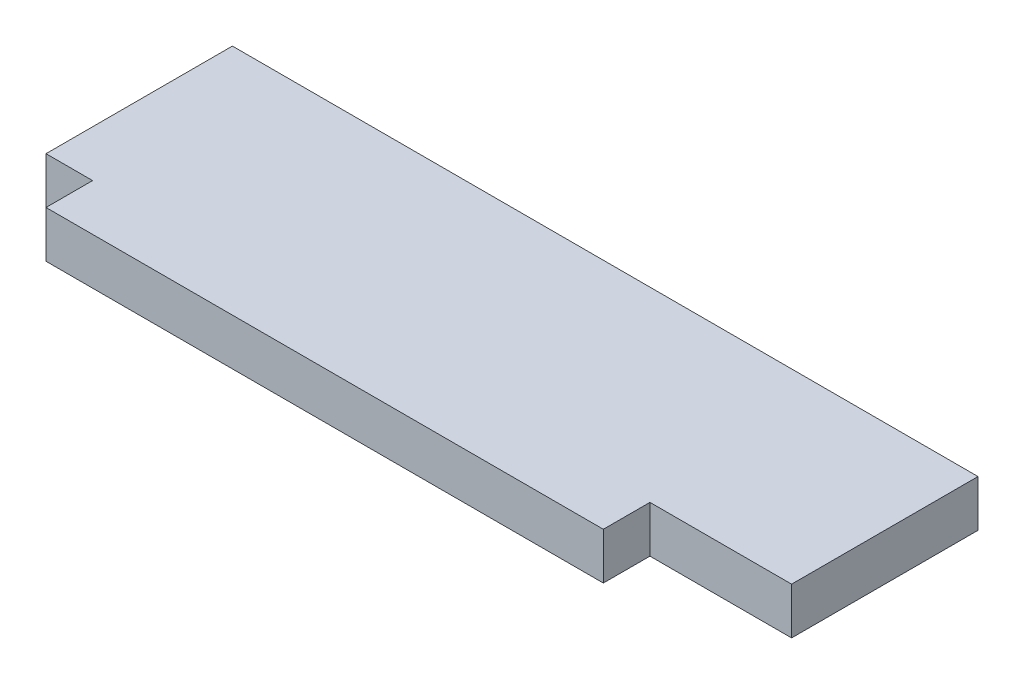
ISO-10303-21;
HEADER;
FILE_DESCRIPTION(('STEP AP214'),'2;1');
FILE_NAME('part.step','',(''),(''),'','','');
FILE_SCHEMA(('AUTOMOTIVE_DESIGN { 1 0 10303 214 1 1 1 1 }'));
ENDSEC;
DATA;
#1=APPLICATION_CONTEXT('core data for automotive mechanical design processes');
#2=APPLICATION_PROTOCOL_DEFINITION('international standard','automotive_design',2000,#1);
#3=PRODUCT_CONTEXT('',#1,'mechanical');
#4=PRODUCT('Part','Part','',(#3));
#5=PRODUCT_RELATED_PRODUCT_CATEGORY('part','',(#4));
#6=PRODUCT_DEFINITION_FORMATION('','',#4);
#7=PRODUCT_DEFINITION_CONTEXT('part definition',#1,'design');
#8=PRODUCT_DEFINITION('design','',#6,#7);
#9=PRODUCT_DEFINITION_SHAPE('','',#8);
#10=(LENGTH_UNIT() NAMED_UNIT(*) SI_UNIT(.MILLI.,.METRE.));
#11=(NAMED_UNIT(*) PLANE_ANGLE_UNIT() SI_UNIT($,.RADIAN.));
#12=(NAMED_UNIT(*) SI_UNIT($,.STERADIAN.) SOLID_ANGLE_UNIT());
#13=UNCERTAINTY_MEASURE_WITH_UNIT(LENGTH_MEASURE(1.E-05),#10,'distance_accuracy_value','');
#14=(GEOMETRIC_REPRESENTATION_CONTEXT(3) GLOBAL_UNCERTAINTY_ASSIGNED_CONTEXT((#13)) GLOBAL_UNIT_ASSIGNED_CONTEXT((#10,
#11,#12)) REPRESENTATION_CONTEXT('',''));
#15=CARTESIAN_POINT('',(0.,0.,0.));
#16=DIRECTION('',(0.,0.,1.));
#17=DIRECTION('',(1.,0.,0.));
#18=AXIS2_PLACEMENT_3D('',#15,#16,#17);
#19=CARTESIAN_POINT('',(0.,5.,0.));
#20=DIRECTION('',(0.,0.,-1.));
#21=DIRECTION('',(-1.,0.,0.));
#22=AXIS2_PLACEMENT_3D('',#19,#20,#21);
#23=PLANE('',#22);
#24=DIRECTION('',(1.,0.,0.));
#25=VECTOR('',#24,1.);
#26=CARTESIAN_POINT('',(0.,0.,0.));
#27=LINE('',#26,#25);
#28=CARTESIAN_POINT('',(0.,0.,0.));
#29=VERTEX_POINT('',#28);
#30=CARTESIAN_POINT('',(5.,0.,0.));
#31=VERTEX_POINT('',#30);
#32=EDGE_CURVE('E137',#29,#31,#27,.T.);
#33=ORIENTED_EDGE('',*,*,#32,.T.);
#34=DIRECTION('',(0.,-1.,0.));
#35=VECTOR('',#34,1.);
#36=CARTESIAN_POINT('',(5.,5.,0.));
#37=LINE('',#36,#35);
#38=CARTESIAN_POINT('',(5.,5.,0.));
#39=VERTEX_POINT('',#38);
#40=EDGE_CURVE('E11',#39,#31,#37,.T.);
#41=ORIENTED_EDGE('',*,*,#40,.F.);
#42=DIRECTION('',(1.,0.,0.));
#43=VECTOR('',#42,1.);
#44=CARTESIAN_POINT('',(0.,5.,0.));
#45=LINE('',#44,#43);
#46=CARTESIAN_POINT('',(0.,5.,0.));
#47=VERTEX_POINT('',#46);
#48=EDGE_CURVE('E154',#47,#39,#45,.T.);
#49=ORIENTED_EDGE('',*,*,#48,.F.);
#50=DIRECTION('',(0.,-1.,0.));
#51=VECTOR('',#50,1.);
#52=CARTESIAN_POINT('',(0.,5.,0.));
#53=LINE('',#52,#51);
#54=EDGE_CURVE('E55',#47,#29,#53,.T.);
#55=ORIENTED_EDGE('',*,*,#54,.T.);
#56=EDGE_LOOP('',(#33,#41,#49,#55));
#57=FACE_BOUND('',#56,.T.);
#58=ADVANCED_FACE('F38',(#57),#23,.F.);
#59=CARTESIAN_POINT('',(5.,5.,0.));
#60=DIRECTION('',(1.,0.,0.));
#61=DIRECTION('',(0.,0.,-1.));
#62=AXIS2_PLACEMENT_3D('',#59,#60,#61);
#63=PLANE('',#62);
#64=DIRECTION('',(0.,0.,1.));
#65=VECTOR('',#64,1.);
#66=CARTESIAN_POINT('',(5.,0.,0.));
#67=LINE('',#66,#65);
#68=CARTESIAN_POINT('',(5.,0.,5.));
#69=VERTEX_POINT('',#68);
#70=EDGE_CURVE('E139',#31,#69,#67,.T.);
#71=ORIENTED_EDGE('',*,*,#70,.T.);
#72=DIRECTION('',(0.,-1.,0.));
#73=VECTOR('',#72,1.);
#74=CARTESIAN_POINT('',(5.,5.,5.));
#75=LINE('',#74,#73);
#76=CARTESIAN_POINT('',(5.,5.,5.));
#77=VERTEX_POINT('',#76);
#78=EDGE_CURVE('E47',#77,#69,#75,.T.);
#79=ORIENTED_EDGE('',*,*,#78,.F.);
#80=DIRECTION('',(0.,0.,1.));
#81=VECTOR('',#80,1.);
#82=CARTESIAN_POINT('',(5.,5.,0.));
#83=LINE('',#82,#81);
#84=EDGE_CURVE('E93',#39,#77,#83,.T.);
#85=ORIENTED_EDGE('',*,*,#84,.F.);
#86=ORIENTED_EDGE('',*,*,#40,.T.);
#87=EDGE_LOOP('',(#71,#79,#85,#86));
#88=FACE_BOUND('',#87,.T.);
#89=ADVANCED_FACE('F40',(#88),#63,.F.);
#90=CARTESIAN_POINT('',(0.,5.,5.));
#91=DIRECTION('',(0.,0.,-1.));
#92=DIRECTION('',(-1.,0.,0.));
#93=AXIS2_PLACEMENT_3D('',#90,#91,#92);
#94=PLANE('',#93);
#95=DIRECTION('',(1.,0.,0.));
#96=VECTOR('',#95,1.);
#97=CARTESIAN_POINT('',(0.,0.,5.));
#98=LINE('',#97,#96);
#99=CARTESIAN_POINT('',(64.8,0.,5.));
#100=VERTEX_POINT('',#99);
#101=EDGE_CURVE('E142',#69,#100,#98,.T.);
#102=ORIENTED_EDGE('',*,*,#101,.T.);
#103=DIRECTION('',(0.,-1.,0.));
#104=VECTOR('',#103,1.);
#105=CARTESIAN_POINT('',(64.8,5.,5.));
#106=LINE('',#105,#104);
#107=CARTESIAN_POINT('',(64.8,5.,5.));
#108=VERTEX_POINT('',#107);
#109=EDGE_CURVE('E160',#108,#100,#106,.T.);
#110=ORIENTED_EDGE('',*,*,#109,.F.);
#111=DIRECTION('',(1.,0.,0.));
#112=VECTOR('',#111,1.);
#113=CARTESIAN_POINT('',(0.,5.,5.));
#114=LINE('',#113,#112);
#115=EDGE_CURVE('E167',#77,#108,#114,.T.);
#116=ORIENTED_EDGE('',*,*,#115,.F.);
#117=ORIENTED_EDGE('',*,*,#78,.T.);
#118=EDGE_LOOP('',(#102,#110,#116,#117));
#119=FACE_BOUND('',#118,.T.);
#120=ADVANCED_FACE('F165',(#119),#94,.F.);
#121=CARTESIAN_POINT('',(64.8,5.,0.));
#122=DIRECTION('',(1.,0.,0.));
#123=DIRECTION('',(0.,0.,-1.));
#124=AXIS2_PLACEMENT_3D('',#121,#122,#123);
#125=PLANE('',#124);
#126=DIRECTION('',(0.,0.,1.));
#127=VECTOR('',#126,1.);
#128=CARTESIAN_POINT('',(64.8,0.,0.));
#129=LINE('',#128,#127);
#130=CARTESIAN_POINT('',(64.8,0.,0.));
#131=VERTEX_POINT('',#130);
#132=EDGE_CURVE('E145',#131,#100,#129,.T.);
#133=ORIENTED_EDGE('',*,*,#132,.F.);
#134=DIRECTION('',(0.,-1.,0.));
#135=VECTOR('',#134,1.);
#136=CARTESIAN_POINT('',(64.8,5.,0.));
#137=LINE('',#136,#135);
#138=CARTESIAN_POINT('',(64.8,5.,0.));
#139=VERTEX_POINT('',#138);
#140=EDGE_CURVE('E158',#139,#131,#137,.T.);
#141=ORIENTED_EDGE('',*,*,#140,.F.);
#142=DIRECTION('',(0.,0.,1.));
#143=VECTOR('',#142,1.);
#144=CARTESIAN_POINT('',(64.8,5.,0.));
#145=LINE('',#144,#143);
#146=EDGE_CURVE('E175',#139,#108,#145,.T.);
#147=ORIENTED_EDGE('',*,*,#146,.T.);
#148=ORIENTED_EDGE('',*,*,#109,.T.);
#149=EDGE_LOOP('',(#133,#141,#147,#148));
#150=FACE_BOUND('',#149,.T.);
#151=ADVANCED_FACE('F173',(#150),#125,.T.);
#152=CARTESIAN_POINT('',(80.,0.,0.));
#153=VERTEX_POINT('',#152);
#154=EDGE_CURVE('E140',#131,#153,#27,.T.);
#155=ORIENTED_EDGE('',*,*,#154,.T.);
#156=DIRECTION('',(0.,-1.,0.));
#157=VECTOR('',#156,1.);
#158=CARTESIAN_POINT('',(80.,5.,0.));
#159=LINE('',#158,#157);
#160=CARTESIAN_POINT('',(80.,5.,0.));
#161=VERTEX_POINT('',#160);
#162=EDGE_CURVE('E129',#161,#153,#159,.T.);
#163=ORIENTED_EDGE('',*,*,#162,.F.);
#164=EDGE_CURVE('E117',#139,#161,#45,.T.);
#165=ORIENTED_EDGE('',*,*,#164,.F.);
#166=ORIENTED_EDGE('',*,*,#140,.T.);
#167=EDGE_LOOP('',(#155,#163,#165,#166));
#168=FACE_BOUND('',#167,.T.);
#169=ADVANCED_FACE('F186',(#168),#23,.F.);
#170=CARTESIAN_POINT('',(80.,5.,0.));
#171=DIRECTION('',(-1.,0.,0.));
#172=DIRECTION('',(0.,0.,1.));
#173=AXIS2_PLACEMENT_3D('',#170,#171,#172);
#174=PLANE('',#173);
#175=DIRECTION('',(0.,0.,-1.));
#176=VECTOR('',#175,1.);
#177=CARTESIAN_POINT('',(80.,0.,0.));
#178=LINE('',#177,#176);
#179=CARTESIAN_POINT('',(80.,0.,-20.));
#180=VERTEX_POINT('',#179);
#181=EDGE_CURVE('E126',#153,#180,#178,.T.);
#182=ORIENTED_EDGE('',*,*,#181,.T.);
#183=DIRECTION('',(0.,-1.,0.));
#184=VECTOR('',#183,1.);
#185=CARTESIAN_POINT('',(80.,5.,-20.));
#186=LINE('',#185,#184);
#187=CARTESIAN_POINT('',(80.,5.,-20.));
#188=VERTEX_POINT('',#187);
#189=EDGE_CURVE('E123',#188,#180,#186,.T.);
#190=ORIENTED_EDGE('',*,*,#189,.F.);
#191=DIRECTION('',(0.,0.,-1.));
#192=VECTOR('',#191,1.);
#193=CARTESIAN_POINT('',(80.,5.,0.));
#194=LINE('',#193,#192);
#195=EDGE_CURVE('E109',#161,#188,#194,.T.);
#196=ORIENTED_EDGE('',*,*,#195,.F.);
#197=ORIENTED_EDGE('',*,*,#162,.T.);
#198=EDGE_LOOP('',(#182,#190,#196,#197));
#199=FACE_BOUND('',#198,.T.);
#200=ADVANCED_FACE('F124',(#199),#174,.F.);
#201=CARTESIAN_POINT('',(0.,5.,-20.));
#202=DIRECTION('',(0.,0.,-1.));
#203=DIRECTION('',(-1.,0.,0.));
#204=AXIS2_PLACEMENT_3D('',#201,#202,#203);
#205=PLANE('',#204);
#206=DIRECTION('',(1.,0.,0.));
#207=VECTOR('',#206,1.);
#208=CARTESIAN_POINT('',(0.,0.,-20.));
#209=LINE('',#208,#207);
#210=CARTESIAN_POINT('',(0.,0.,-20.));
#211=VERTEX_POINT('',#210);
#212=EDGE_CURVE('E149',#211,#180,#209,.T.);
#213=ORIENTED_EDGE('',*,*,#212,.F.);
#214=DIRECTION('',(0.,-1.,0.));
#215=VECTOR('',#214,1.);
#216=CARTESIAN_POINT('',(0.,5.,-20.));
#217=LINE('',#216,#215);
#218=CARTESIAN_POINT('',(0.,5.,-20.));
#219=VERTEX_POINT('',#218);
#220=EDGE_CURVE('E81',#219,#211,#217,.T.);
#221=ORIENTED_EDGE('',*,*,#220,.F.);
#222=DIRECTION('',(1.,0.,0.));
#223=VECTOR('',#222,1.);
#224=CARTESIAN_POINT('',(0.,5.,-20.));
#225=LINE('',#224,#223);
#226=EDGE_CURVE('E114',#219,#188,#225,.T.);
#227=ORIENTED_EDGE('',*,*,#226,.T.);
#228=ORIENTED_EDGE('',*,*,#189,.T.);
#229=EDGE_LOOP('',(#213,#221,#227,#228));
#230=FACE_BOUND('',#229,.T.);
#231=ADVANCED_FACE('F131',(#230),#205,.T.);
#232=CARTESIAN_POINT('',(0.,5.,0.));
#233=DIRECTION('',(-1.,0.,0.));
#234=DIRECTION('',(0.,0.,1.));
#235=AXIS2_PLACEMENT_3D('',#232,#233,#234);
#236=PLANE('',#235);
#237=DIRECTION('',(0.,0.,-1.));
#238=VECTOR('',#237,1.);
#239=CARTESIAN_POINT('',(0.,0.,0.));
#240=LINE('',#239,#238);
#241=EDGE_CURVE('E151',#29,#211,#240,.T.);
#242=ORIENTED_EDGE('',*,*,#241,.F.);
#243=ORIENTED_EDGE('',*,*,#54,.F.);
#244=DIRECTION('',(0.,0.,-1.));
#245=VECTOR('',#244,1.);
#246=CARTESIAN_POINT('',(0.,5.,0.));
#247=LINE('',#246,#245);
#248=EDGE_CURVE('E132',#47,#219,#247,.T.);
#249=ORIENTED_EDGE('',*,*,#248,.T.);
#250=ORIENTED_EDGE('',*,*,#220,.T.);
#251=EDGE_LOOP('',(#242,#243,#249,#250));
#252=FACE_BOUND('',#251,.T.);
#253=ADVANCED_FACE('F197',(#252),#236,.T.);
#254=CARTESIAN_POINT('',(0.,5.,0.));
#255=DIRECTION('',(0.,1.,0.));
#256=DIRECTION('',(0.,0.,1.));
#257=AXIS2_PLACEMENT_3D('',#254,#255,#256);
#258=PLANE('',#257);
#259=ORIENTED_EDGE('',*,*,#48,.T.);
#260=ORIENTED_EDGE('',*,*,#84,.T.);
#261=ORIENTED_EDGE('',*,*,#115,.T.);
#262=ORIENTED_EDGE('',*,*,#146,.F.);
#263=ORIENTED_EDGE('',*,*,#164,.T.);
#264=ORIENTED_EDGE('',*,*,#195,.T.);
#265=ORIENTED_EDGE('',*,*,#226,.F.);
#266=ORIENTED_EDGE('',*,*,#248,.F.);
#267=EDGE_LOOP('',(#259,#260,#261,#262,#263,#264,#265,#266));
#268=FACE_BOUND('',#267,.T.);
#269=ADVANCED_FACE('F111',(#268),#258,.T.);
#270=CARTESIAN_POINT('',(0.,0.,0.));
#271=DIRECTION('',(0.,1.,0.));
#272=DIRECTION('',(0.,0.,1.));
#273=AXIS2_PLACEMENT_3D('',#270,#271,#272);
#274=PLANE('',#273);
#275=ORIENTED_EDGE('',*,*,#32,.F.);
#276=ORIENTED_EDGE('',*,*,#241,.T.);
#277=ORIENTED_EDGE('',*,*,#212,.T.);
#278=ORIENTED_EDGE('',*,*,#181,.F.);
#279=ORIENTED_EDGE('',*,*,#154,.F.);
#280=ORIENTED_EDGE('',*,*,#132,.T.);
#281=ORIENTED_EDGE('',*,*,#101,.F.);
#282=ORIENTED_EDGE('',*,*,#70,.F.);
#283=EDGE_LOOP('',(#275,#276,#277,#278,#279,#280,#281,#282));
#284=FACE_BOUND('',#283,.T.);
#285=ADVANCED_FACE('F169',(#284),#274,.F.);
#286=CLOSED_SHELL('',(#58,#89,#120,#151,#169,#200,#231,#253,#269,#285));
#287=MANIFOLD_SOLID_BREP('B2',#286);
#288=ADVANCED_BREP_SHAPE_REPRESENTATION('',(#18,#287),#14);
#289=SHAPE_DEFINITION_REPRESENTATION(#9,#288);
ENDSEC;
END-ISO-10303-21;
